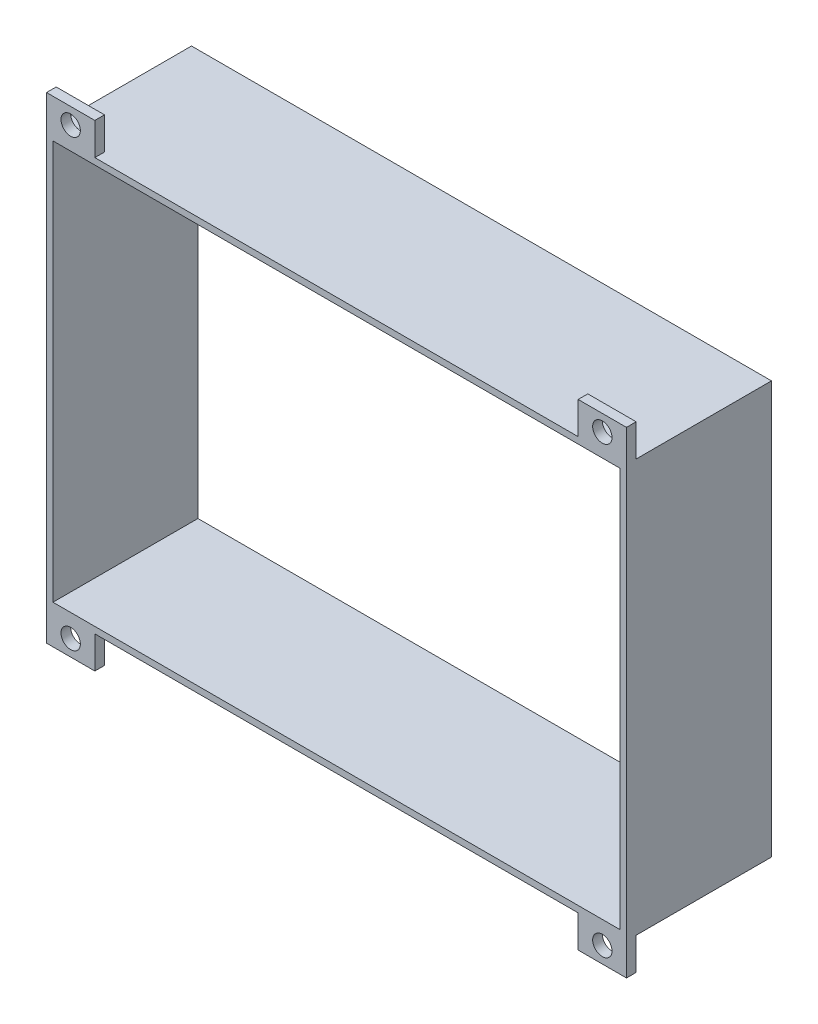
ISO-10303-21;
HEADER;
FILE_DESCRIPTION(('STEP AP214'),'2;1');
FILE_NAME('part.step','',(''),(''),'','','');
FILE_SCHEMA(('AUTOMOTIVE_DESIGN { 1 0 10303 214 1 1 1 1 }'));
ENDSEC;
DATA;
#1=APPLICATION_CONTEXT('core data for automotive mechanical design processes');
#2=APPLICATION_PROTOCOL_DEFINITION('international standard','automotive_design',2000,#1);
#3=PRODUCT_CONTEXT('',#1,'mechanical');
#4=PRODUCT('Part','Part','',(#3));
#5=PRODUCT_RELATED_PRODUCT_CATEGORY('part','',(#4));
#6=PRODUCT_DEFINITION_FORMATION('','',#4);
#7=PRODUCT_DEFINITION_CONTEXT('part definition',#1,'design');
#8=PRODUCT_DEFINITION('design','',#6,#7);
#9=PRODUCT_DEFINITION_SHAPE('','',#8);
#10=(LENGTH_UNIT() NAMED_UNIT(*) SI_UNIT(.MILLI.,.METRE.));
#11=(NAMED_UNIT(*) PLANE_ANGLE_UNIT() SI_UNIT($,.RADIAN.));
#12=(NAMED_UNIT(*) SI_UNIT($,.STERADIAN.) SOLID_ANGLE_UNIT());
#13=UNCERTAINTY_MEASURE_WITH_UNIT(LENGTH_MEASURE(1.E-05),#10,'distance_accuracy_value','');
#14=(GEOMETRIC_REPRESENTATION_CONTEXT(3) GLOBAL_UNCERTAINTY_ASSIGNED_CONTEXT((#13)) GLOBAL_UNIT_ASSIGNED_CONTEXT((#10,
#11,#12)) REPRESENTATION_CONTEXT('',''));
#15=CARTESIAN_POINT('',(0.,0.,0.));
#16=DIRECTION('',(0.,0.,1.));
#17=DIRECTION('',(1.,0.,0.));
#18=AXIS2_PLACEMENT_3D('',#15,#16,#17);
#19=CARTESIAN_POINT('',(-90.,-64.,45.));
#20=DIRECTION('',(0.,1.,0.));
#21=DIRECTION('',(0.,0.,1.));
#22=AXIS2_PLACEMENT_3D('',#19,#20,#21);
#23=PLANE('',#22);
#24=DIRECTION('',(1.,0.,0.));
#25=VECTOR('',#24,1.);
#26=CARTESIAN_POINT('',(-90.,-64.,42.));
#27=LINE('',#26,#25);
#28=CARTESIAN_POINT('',(-90.,-64.,42.));
#29=VERTEX_POINT('',#28);
#30=CARTESIAN_POINT('',(-75.,-64.,42.));
#31=VERTEX_POINT('',#30);
#32=EDGE_CURVE('E248',#29,#31,#27,.T.);
#33=ORIENTED_EDGE('',*,*,#32,.F.);
#34=DIRECTION('',(0.,0.,-1.));
#35=VECTOR('',#34,1.);
#36=CARTESIAN_POINT('',(-90.,-64.,45.));
#37=LINE('',#36,#35);
#38=CARTESIAN_POINT('',(-90.,-64.,0.));
#39=VERTEX_POINT('',#38);
#40=EDGE_CURVE('E342',#29,#39,#37,.T.);
#41=ORIENTED_EDGE('',*,*,#40,.T.);
#42=DIRECTION('',(1.,0.,0.));
#43=VECTOR('',#42,1.);
#44=CARTESIAN_POINT('',(-90.,-64.,0.));
#45=LINE('',#44,#43);
#46=CARTESIAN_POINT('',(90.,-64.,0.));
#47=VERTEX_POINT('',#46);
#48=EDGE_CURVE('E328',#39,#47,#45,.T.);
#49=ORIENTED_EDGE('',*,*,#48,.T.);
#50=DIRECTION('',(0.,0.,-1.));
#51=VECTOR('',#50,1.);
#52=CARTESIAN_POINT('',(90.,-64.,45.));
#53=LINE('',#52,#51);
#54=CARTESIAN_POINT('',(90.,-64.,42.));
#55=VERTEX_POINT('',#54);
#56=EDGE_CURVE('E331',#55,#47,#53,.T.);
#57=ORIENTED_EDGE('',*,*,#56,.F.);
#58=DIRECTION('',(1.,0.,0.));
#59=VECTOR('',#58,1.);
#60=CARTESIAN_POINT('',(90.,-64.,42.));
#61=LINE('',#60,#59);
#62=CARTESIAN_POINT('',(75.,-64.,42.));
#63=VERTEX_POINT('',#62);
#64=EDGE_CURVE('E275',#63,#55,#61,.T.);
#65=ORIENTED_EDGE('',*,*,#64,.F.);
#66=DIRECTION('',(0.,0.,-1.));
#67=VECTOR('',#66,1.);
#68=CARTESIAN_POINT('',(75.,-64.,45.));
#69=LINE('',#68,#67);
#70=CARTESIAN_POINT('',(75.,-64.,45.));
#71=VERTEX_POINT('',#70);
#72=EDGE_CURVE('E270',#71,#63,#69,.T.);
#73=ORIENTED_EDGE('',*,*,#72,.F.);
#74=DIRECTION('',(1.,0.,0.));
#75=VECTOR('',#74,1.);
#76=CARTESIAN_POINT('',(-90.,-64.,45.));
#77=LINE('',#76,#75);
#78=CARTESIAN_POINT('',(-75.,-64.,45.));
#79=VERTEX_POINT('',#78);
#80=EDGE_CURVE('E183',#79,#71,#77,.T.);
#81=ORIENTED_EDGE('',*,*,#80,.F.);
#82=DIRECTION('',(0.,0.,1.));
#83=VECTOR('',#82,1.);
#84=CARTESIAN_POINT('',(-75.,-64.,45.));
#85=LINE('',#84,#83);
#86=EDGE_CURVE('E251',#31,#79,#85,.T.);
#87=ORIENTED_EDGE('',*,*,#86,.F.);
#88=EDGE_LOOP('',(#33,#41,#49,#57,#65,#73,#81,#87));
#89=FACE_BOUND('',#88,.T.);
#90=ADVANCED_FACE('F33',(#89),#23,.F.);
#91=CARTESIAN_POINT('',(0.,0.,45.));
#92=DIRECTION('',(0.,0.,1.));
#93=DIRECTION('',(1.,0.,0.));
#94=AXIS2_PLACEMENT_3D('',#91,#92,#93);
#95=PLANE('',#94);
#96=CARTESIAN_POINT('',(82.5,69.,45.));
#97=DIRECTION('',(0.,0.,1.));
#98=DIRECTION('',(1.,0.,0.));
#99=AXIS2_PLACEMENT_3D('',#96,#97,#98);
#100=CIRCLE('',#99,3.00000000000001);
#101=CARTESIAN_POINT('',(85.5,69.,45.));
#102=VERTEX_POINT('',#101);
#103=EDGE_CURVE('E209',#102,#102,#100,.F.);
#104=ORIENTED_EDGE('',*,*,#103,.T.);
#105=EDGE_LOOP('',(#104));
#106=FACE_BOUND('',#105,.T.);
#107=CARTESIAN_POINT('',(-82.5,69.,45.));
#108=DIRECTION('',(0.,0.,1.));
#109=DIRECTION('',(1.,0.,0.));
#110=AXIS2_PLACEMENT_3D('',#107,#108,#109);
#111=CIRCLE('',#110,3.00000000000001);
#112=CARTESIAN_POINT('',(-79.5,69.,45.));
#113=VERTEX_POINT('',#112);
#114=EDGE_CURVE('E483',#113,#113,#111,.F.);
#115=ORIENTED_EDGE('',*,*,#114,.T.);
#116=EDGE_LOOP('',(#115));
#117=FACE_BOUND('',#116,.T.);
#118=CARTESIAN_POINT('',(82.5,-69.,45.));
#119=DIRECTION('',(0.,0.,1.));
#120=DIRECTION('',(1.,0.,0.));
#121=AXIS2_PLACEMENT_3D('',#118,#119,#120);
#122=CIRCLE('',#121,3.00000000000001);
#123=CARTESIAN_POINT('',(85.5,-69.,45.));
#124=VERTEX_POINT('',#123);
#125=EDGE_CURVE('E245',#124,#124,#122,.T.);
#126=ORIENTED_EDGE('',*,*,#125,.F.);
#127=EDGE_LOOP('',(#126));
#128=FACE_BOUND('',#127,.T.);
#129=CARTESIAN_POINT('',(-82.5,-69.,45.));
#130=DIRECTION('',(0.,0.,1.));
#131=DIRECTION('',(1.,0.,0.));
#132=AXIS2_PLACEMENT_3D('',#129,#130,#131);
#133=CIRCLE('',#132,3.00000000000001);
#134=CARTESIAN_POINT('',(-79.5,-69.,45.));
#135=VERTEX_POINT('',#134);
#136=EDGE_CURVE('E240',#135,#135,#133,.T.);
#137=ORIENTED_EDGE('',*,*,#136,.F.);
#138=EDGE_LOOP('',(#137));
#139=FACE_BOUND('',#138,.T.);
#140=DIRECTION('',(0.,1.,0.));
#141=VECTOR('',#140,1.);
#142=CARTESIAN_POINT('',(90.,64.,45.));
#143=LINE('',#142,#141);
#144=CARTESIAN_POINT('',(90.,-74.,45.));
#145=VERTEX_POINT('',#144);
#146=CARTESIAN_POINT('',(90.,74.,45.));
#147=VERTEX_POINT('',#146);
#148=EDGE_CURVE('E326',#145,#147,#143,.T.);
#149=ORIENTED_EDGE('',*,*,#148,.T.);
#150=DIRECTION('',(-1.,0.,0.));
#151=VECTOR('',#150,1.);
#152=CARTESIAN_POINT('',(90.,74.,45.));
#153=LINE('',#152,#151);
#154=CARTESIAN_POINT('',(75.,74.,45.));
#155=VERTEX_POINT('',#154);
#156=EDGE_CURVE('E225',#147,#155,#153,.T.);
#157=ORIENTED_EDGE('',*,*,#156,.T.);
#158=DIRECTION('',(0.,-1.,0.));
#159=VECTOR('',#158,1.);
#160=CARTESIAN_POINT('',(75.,74.,45.));
#161=LINE('',#160,#159);
#162=CARTESIAN_POINT('',(75.,64.,45.));
#163=VERTEX_POINT('',#162);
#164=EDGE_CURVE('E228',#155,#163,#161,.T.);
#165=ORIENTED_EDGE('',*,*,#164,.T.);
#166=DIRECTION('',(-1.,0.,0.));
#167=VECTOR('',#166,1.);
#168=CARTESIAN_POINT('',(-90.,64.,45.));
#169=LINE('',#168,#167);
#170=CARTESIAN_POINT('',(-75.,64.,45.));
#171=VERTEX_POINT('',#170);
#172=EDGE_CURVE('E184',#163,#171,#169,.T.);
#173=ORIENTED_EDGE('',*,*,#172,.T.);
#174=DIRECTION('',(0.,-1.,0.));
#175=VECTOR('',#174,1.);
#176=CARTESIAN_POINT('',(-75.,74.,45.));
#177=LINE('',#176,#175);
#178=CARTESIAN_POINT('',(-75.,74.,45.));
#179=VERTEX_POINT('',#178);
#180=EDGE_CURVE('E198',#179,#171,#177,.T.);
#181=ORIENTED_EDGE('',*,*,#180,.F.);
#182=DIRECTION('',(-1.,0.,0.));
#183=VECTOR('',#182,1.);
#184=CARTESIAN_POINT('',(-90.,74.,45.));
#185=LINE('',#184,#183);
#186=CARTESIAN_POINT('',(-90.,74.,45.));
#187=VERTEX_POINT('',#186);
#188=EDGE_CURVE('E190',#179,#187,#185,.T.);
#189=ORIENTED_EDGE('',*,*,#188,.T.);
#190=DIRECTION('',(0.,-1.,0.));
#191=VECTOR('',#190,1.);
#192=CARTESIAN_POINT('',(-90.,64.,45.));
#193=LINE('',#192,#191);
#194=CARTESIAN_POINT('',(-90.,-74.,45.));
#195=VERTEX_POINT('',#194);
#196=EDGE_CURVE('E170',#187,#195,#193,.T.);
#197=ORIENTED_EDGE('',*,*,#196,.T.);
#198=DIRECTION('',(-1.,0.,0.));
#199=VECTOR('',#198,1.);
#200=CARTESIAN_POINT('',(-90.,-74.,45.));
#201=LINE('',#200,#199);
#202=CARTESIAN_POINT('',(-75.,-74.,45.));
#203=VERTEX_POINT('',#202);
#204=EDGE_CURVE('E255',#203,#195,#201,.T.);
#205=ORIENTED_EDGE('',*,*,#204,.F.);
#206=DIRECTION('',(0.,1.,0.));
#207=VECTOR('',#206,1.);
#208=CARTESIAN_POINT('',(-75.,-74.,45.));
#209=LINE('',#208,#207);
#210=EDGE_CURVE('E257',#203,#79,#209,.T.);
#211=ORIENTED_EDGE('',*,*,#210,.T.);
#212=ORIENTED_EDGE('',*,*,#80,.T.);
#213=DIRECTION('',(0.,1.,0.));
#214=VECTOR('',#213,1.);
#215=CARTESIAN_POINT('',(75.,-74.,45.));
#216=LINE('',#215,#214);
#217=CARTESIAN_POINT('',(75.,-74.,45.));
#218=VERTEX_POINT('',#217);
#219=EDGE_CURVE('E291',#218,#71,#216,.T.);
#220=ORIENTED_EDGE('',*,*,#219,.F.);
#221=DIRECTION('',(-1.,0.,0.));
#222=VECTOR('',#221,1.);
#223=CARTESIAN_POINT('',(90.,-74.,45.));
#224=LINE('',#223,#222);
#225=EDGE_CURVE('E274',#145,#218,#224,.T.);
#226=ORIENTED_EDGE('',*,*,#225,.F.);
#227=EDGE_LOOP('',(#149,#157,#165,#173,#181,#189,#197,#205,#211,#212,#220,#226));
#228=FACE_BOUND('',#227,.T.);
#229=DIRECTION('',(-1.,0.,0.));
#230=VECTOR('',#229,1.);
#231=CARTESIAN_POINT('',(-88.,62.,45.));
#232=LINE('',#231,#230);
#233=CARTESIAN_POINT('',(88.,62.,45.));
#234=VERTEX_POINT('',#233);
#235=CARTESIAN_POINT('',(-88.,62.,45.));
#236=VERTEX_POINT('',#235);
#237=EDGE_CURVE('E297',#234,#236,#232,.T.);
#238=ORIENTED_EDGE('',*,*,#237,.F.);
#239=DIRECTION('',(0.,1.,0.));
#240=VECTOR('',#239,1.);
#241=CARTESIAN_POINT('',(88.,62.,45.));
#242=LINE('',#241,#240);
#243=CARTESIAN_POINT('',(88.,-62.,45.));
#244=VERTEX_POINT('',#243);
#245=EDGE_CURVE('E295',#244,#234,#242,.T.);
#246=ORIENTED_EDGE('',*,*,#245,.F.);
#247=DIRECTION('',(1.,0.,0.));
#248=VECTOR('',#247,1.);
#249=CARTESIAN_POINT('',(-88.,-62.,45.));
#250=LINE('',#249,#248);
#251=CARTESIAN_POINT('',(-88.,-62.,45.));
#252=VERTEX_POINT('',#251);
#253=EDGE_CURVE('E303',#252,#244,#250,.T.);
#254=ORIENTED_EDGE('',*,*,#253,.F.);
#255=DIRECTION('',(0.,-1.,0.));
#256=VECTOR('',#255,1.);
#257=CARTESIAN_POINT('',(-88.,62.,45.));
#258=LINE('',#257,#256);
#259=EDGE_CURVE('E300',#236,#252,#258,.T.);
#260=ORIENTED_EDGE('',*,*,#259,.F.);
#261=EDGE_LOOP('',(#238,#246,#254,#260));
#262=FACE_BOUND('',#261,.T.);
#263=ADVANCED_FACE('F195',(#106,#117,#128,#139,#228,#262),#95,.T.);
#264=CARTESIAN_POINT('',(0.,0.,0.));
#265=DIRECTION('',(0.,0.,1.));
#266=DIRECTION('',(1.,0.,0.));
#267=AXIS2_PLACEMENT_3D('',#264,#265,#266);
#268=PLANE('',#267);
#269=DIRECTION('',(0.,1.,0.));
#270=VECTOR('',#269,1.);
#271=CARTESIAN_POINT('',(90.,64.,0.));
#272=LINE('',#271,#270);
#273=CARTESIAN_POINT('',(90.,64.,0.));
#274=VERTEX_POINT('',#273);
#275=EDGE_CURVE('E325',#47,#274,#272,.T.);
#276=ORIENTED_EDGE('',*,*,#275,.F.);
#277=ORIENTED_EDGE('',*,*,#48,.F.);
#278=DIRECTION('',(0.,-1.,0.));
#279=VECTOR('',#278,1.);
#280=CARTESIAN_POINT('',(-90.,64.,0.));
#281=LINE('',#280,#279);
#282=CARTESIAN_POINT('',(-90.,64.,0.));
#283=VERTEX_POINT('',#282);
#284=EDGE_CURVE('E337',#283,#39,#281,.T.);
#285=ORIENTED_EDGE('',*,*,#284,.F.);
#286=DIRECTION('',(-1.,0.,0.));
#287=VECTOR('',#286,1.);
#288=CARTESIAN_POINT('',(-90.,64.,0.));
#289=LINE('',#288,#287);
#290=EDGE_CURVE('E334',#274,#283,#289,.T.);
#291=ORIENTED_EDGE('',*,*,#290,.F.);
#292=EDGE_LOOP('',(#276,#277,#285,#291));
#293=FACE_BOUND('',#292,.T.);
#294=DIRECTION('',(0.,1.,0.));
#295=VECTOR('',#294,1.);
#296=CARTESIAN_POINT('',(88.,62.,0.));
#297=LINE('',#296,#295);
#298=CARTESIAN_POINT('',(88.,-62.,0.));
#299=VERTEX_POINT('',#298);
#300=CARTESIAN_POINT('',(88.,62.,0.));
#301=VERTEX_POINT('',#300);
#302=EDGE_CURVE('E294',#299,#301,#297,.T.);
#303=ORIENTED_EDGE('',*,*,#302,.T.);
#304=DIRECTION('',(-1.,0.,0.));
#305=VECTOR('',#304,1.);
#306=CARTESIAN_POINT('',(-88.,62.,0.));
#307=LINE('',#306,#305);
#308=CARTESIAN_POINT('',(-88.,62.,0.));
#309=VERTEX_POINT('',#308);
#310=EDGE_CURVE('E308',#301,#309,#307,.T.);
#311=ORIENTED_EDGE('',*,*,#310,.T.);
#312=DIRECTION('',(0.,-1.,0.));
#313=VECTOR('',#312,1.);
#314=CARTESIAN_POINT('',(-88.,62.,0.));
#315=LINE('',#314,#313);
#316=CARTESIAN_POINT('',(-88.,-62.,0.));
#317=VERTEX_POINT('',#316);
#318=EDGE_CURVE('E311',#309,#317,#315,.T.);
#319=ORIENTED_EDGE('',*,*,#318,.T.);
#320=DIRECTION('',(1.,0.,0.));
#321=VECTOR('',#320,1.);
#322=CARTESIAN_POINT('',(-88.,-62.,0.));
#323=LINE('',#322,#321);
#324=EDGE_CURVE('E298',#317,#299,#323,.T.);
#325=ORIENTED_EDGE('',*,*,#324,.T.);
#326=EDGE_LOOP('',(#303,#311,#319,#325));
#327=FACE_BOUND('',#326,.T.);
#328=ADVANCED_FACE('F352',(#293,#327),#268,.F.);
#329=CARTESIAN_POINT('',(90.,64.,45.));
#330=DIRECTION('',(-1.,0.,0.));
#331=DIRECTION('',(0.,-1.,0.));
#332=AXIS2_PLACEMENT_3D('',#329,#330,#331);
#333=PLANE('',#332);
#334=ORIENTED_EDGE('',*,*,#275,.T.);
#335=DIRECTION('',(0.,0.,-1.));
#336=VECTOR('',#335,1.);
#337=CARTESIAN_POINT('',(90.,64.,45.));
#338=LINE('',#337,#336);
#339=CARTESIAN_POINT('',(90.,64.,42.));
#340=VERTEX_POINT('',#339);
#341=EDGE_CURVE('E11',#340,#274,#338,.T.);
#342=ORIENTED_EDGE('',*,*,#341,.F.);
#343=DIRECTION('',(0.,-1.,0.));
#344=VECTOR('',#343,1.);
#345=CARTESIAN_POINT('',(90.,74.,42.));
#346=LINE('',#345,#344);
#347=CARTESIAN_POINT('',(90.,74.,42.));
#348=VERTEX_POINT('',#347);
#349=EDGE_CURVE('E56',#348,#340,#346,.T.);
#350=ORIENTED_EDGE('',*,*,#349,.F.);
#351=DIRECTION('',(0.,0.,1.));
#352=VECTOR('',#351,1.);
#353=CARTESIAN_POINT('',(90.,74.,45.));
#354=LINE('',#353,#352);
#355=EDGE_CURVE('E216',#348,#147,#354,.T.);
#356=ORIENTED_EDGE('',*,*,#355,.T.);
#357=ORIENTED_EDGE('',*,*,#148,.F.);
#358=DIRECTION('',(0.,0.,1.));
#359=VECTOR('',#358,1.);
#360=CARTESIAN_POINT('',(90.,-74.,45.));
#361=LINE('',#360,#359);
#362=CARTESIAN_POINT('',(90.,-74.,42.));
#363=VERTEX_POINT('',#362);
#364=EDGE_CURVE('E271',#363,#145,#361,.T.);
#365=ORIENTED_EDGE('',*,*,#364,.F.);
#366=DIRECTION('',(0.,1.,0.));
#367=VECTOR('',#366,1.);
#368=CARTESIAN_POINT('',(90.,-74.,42.));
#369=LINE('',#368,#367);
#370=EDGE_CURVE('E281',#363,#55,#369,.T.);
#371=ORIENTED_EDGE('',*,*,#370,.T.);
#372=ORIENTED_EDGE('',*,*,#56,.T.);
#373=EDGE_LOOP('',(#334,#342,#350,#356,#357,#365,#371,#372));
#374=FACE_BOUND('',#373,.T.);
#375=ADVANCED_FACE('F35',(#374),#333,.F.);
#376=CARTESIAN_POINT('',(-90.,64.,45.));
#377=DIRECTION('',(0.,-1.,0.));
#378=DIRECTION('',(0.,0.,-1.));
#379=AXIS2_PLACEMENT_3D('',#376,#377,#378);
#380=PLANE('',#379);
#381=DIRECTION('',(1.,0.,0.));
#382=VECTOR('',#381,1.);
#383=CARTESIAN_POINT('',(-90.,64.,42.));
#384=LINE('',#383,#382);
#385=CARTESIAN_POINT('',(-90.,64.,42.));
#386=VERTEX_POINT('',#385);
#387=CARTESIAN_POINT('',(-75.,64.,42.));
#388=VERTEX_POINT('',#387);
#389=EDGE_CURVE('E48',#386,#388,#384,.T.);
#390=ORIENTED_EDGE('',*,*,#389,.T.);
#391=DIRECTION('',(0.,0.,1.));
#392=VECTOR('',#391,1.);
#393=CARTESIAN_POINT('',(-75.,64.,45.));
#394=LINE('',#393,#392);
#395=EDGE_CURVE('E206',#388,#171,#394,.T.);
#396=ORIENTED_EDGE('',*,*,#395,.T.);
#397=ORIENTED_EDGE('',*,*,#172,.F.);
#398=DIRECTION('',(0.,0.,-1.));
#399=VECTOR('',#398,1.);
#400=CARTESIAN_POINT('',(75.,64.,45.));
#401=LINE('',#400,#399);
#402=CARTESIAN_POINT('',(75.,64.,42.));
#403=VERTEX_POINT('',#402);
#404=EDGE_CURVE('E220',#163,#403,#401,.T.);
#405=ORIENTED_EDGE('',*,*,#404,.T.);
#406=DIRECTION('',(1.,0.,0.));
#407=VECTOR('',#406,1.);
#408=CARTESIAN_POINT('',(90.,64.,42.));
#409=LINE('',#408,#407);
#410=EDGE_CURVE('E215',#403,#340,#409,.T.);
#411=ORIENTED_EDGE('',*,*,#410,.T.);
#412=ORIENTED_EDGE('',*,*,#341,.T.);
#413=ORIENTED_EDGE('',*,*,#290,.T.);
#414=DIRECTION('',(0.,0.,-1.));
#415=VECTOR('',#414,1.);
#416=CARTESIAN_POINT('',(-90.,64.,45.));
#417=LINE('',#416,#415);
#418=EDGE_CURVE('E41',#386,#283,#417,.T.);
#419=ORIENTED_EDGE('',*,*,#418,.F.);
#420=EDGE_LOOP('',(#390,#396,#397,#405,#411,#412,#413,#419));
#421=FACE_BOUND('',#420,.T.);
#422=ADVANCED_FACE('F348',(#421),#380,.F.);
#423=CARTESIAN_POINT('',(-90.,64.,45.));
#424=DIRECTION('',(1.,0.,0.));
#425=DIRECTION('',(0.,0.,-1.));
#426=AXIS2_PLACEMENT_3D('',#423,#424,#425);
#427=PLANE('',#426);
#428=ORIENTED_EDGE('',*,*,#284,.T.);
#429=ORIENTED_EDGE('',*,*,#40,.F.);
#430=DIRECTION('',(0.,1.,0.));
#431=VECTOR('',#430,1.);
#432=CARTESIAN_POINT('',(-90.,-74.,42.));
#433=LINE('',#432,#431);
#434=CARTESIAN_POINT('',(-90.,-74.,42.));
#435=VERTEX_POINT('',#434);
#436=EDGE_CURVE('E267',#435,#29,#433,.T.);
#437=ORIENTED_EDGE('',*,*,#436,.F.);
#438=DIRECTION('',(0.,0.,-1.));
#439=VECTOR('',#438,1.);
#440=CARTESIAN_POINT('',(-90.,-74.,45.));
#441=LINE('',#440,#439);
#442=EDGE_CURVE('E178',#195,#435,#441,.T.);
#443=ORIENTED_EDGE('',*,*,#442,.F.);
#444=ORIENTED_EDGE('',*,*,#196,.F.);
#445=DIRECTION('',(0.,0.,-1.));
#446=VECTOR('',#445,1.);
#447=CARTESIAN_POINT('',(-90.,74.,45.));
#448=LINE('',#447,#446);
#449=CARTESIAN_POINT('',(-90.,74.,42.));
#450=VERTEX_POINT('',#449);
#451=EDGE_CURVE('E174',#187,#450,#448,.T.);
#452=ORIENTED_EDGE('',*,*,#451,.T.);
#453=DIRECTION('',(0.,-1.,0.));
#454=VECTOR('',#453,1.);
#455=CARTESIAN_POINT('',(-90.,74.,42.));
#456=LINE('',#455,#454);
#457=EDGE_CURVE('E205',#450,#386,#456,.T.);
#458=ORIENTED_EDGE('',*,*,#457,.T.);
#459=ORIENTED_EDGE('',*,*,#418,.T.);
#460=EDGE_LOOP('',(#428,#429,#437,#443,#444,#452,#458,#459));
#461=FACE_BOUND('',#460,.T.);
#462=ADVANCED_FACE('F173',(#461),#427,.F.);
#463=CARTESIAN_POINT('',(88.,62.,45.));
#464=DIRECTION('',(-1.,0.,0.));
#465=DIRECTION('',(0.,-1.,0.));
#466=AXIS2_PLACEMENT_3D('',#463,#464,#465);
#467=PLANE('',#466);
#468=ORIENTED_EDGE('',*,*,#302,.F.);
#469=DIRECTION('',(0.,0.,-1.));
#470=VECTOR('',#469,1.);
#471=CARTESIAN_POINT('',(88.,-62.,45.));
#472=LINE('',#471,#470);
#473=EDGE_CURVE('E305',#244,#299,#472,.T.);
#474=ORIENTED_EDGE('',*,*,#473,.F.);
#475=ORIENTED_EDGE('',*,*,#245,.T.);
#476=DIRECTION('',(0.,0.,-1.));
#477=VECTOR('',#476,1.);
#478=CARTESIAN_POINT('',(88.,62.,45.));
#479=LINE('',#478,#477);
#480=EDGE_CURVE('E322',#234,#301,#479,.T.);
#481=ORIENTED_EDGE('',*,*,#480,.T.);
#482=EDGE_LOOP('',(#468,#474,#475,#481));
#483=FACE_BOUND('',#482,.T.);
#484=ADVANCED_FACE('F413',(#483),#467,.T.);
#485=CARTESIAN_POINT('',(-88.,62.,45.));
#486=DIRECTION('',(0.,-1.,0.));
#487=DIRECTION('',(1.,0.,0.));
#488=AXIS2_PLACEMENT_3D('',#485,#486,#487);
#489=PLANE('',#488);
#490=ORIENTED_EDGE('',*,*,#310,.F.);
#491=ORIENTED_EDGE('',*,*,#480,.F.);
#492=ORIENTED_EDGE('',*,*,#237,.T.);
#493=DIRECTION('',(0.,0.,-1.));
#494=VECTOR('',#493,1.);
#495=CARTESIAN_POINT('',(-88.,62.,45.));
#496=LINE('',#495,#494);
#497=EDGE_CURVE('E320',#236,#309,#496,.T.);
#498=ORIENTED_EDGE('',*,*,#497,.T.);
#499=EDGE_LOOP('',(#490,#491,#492,#498));
#500=FACE_BOUND('',#499,.T.);
#501=ADVANCED_FACE('F525',(#500),#489,.T.);
#502=CARTESIAN_POINT('',(-88.,62.,45.));
#503=DIRECTION('',(1.,0.,0.));
#504=DIRECTION('',(0.,1.,0.));
#505=AXIS2_PLACEMENT_3D('',#502,#503,#504);
#506=PLANE('',#505);
#507=ORIENTED_EDGE('',*,*,#318,.F.);
#508=ORIENTED_EDGE('',*,*,#497,.F.);
#509=ORIENTED_EDGE('',*,*,#259,.T.);
#510=DIRECTION('',(0.,0.,-1.));
#511=VECTOR('',#510,1.);
#512=CARTESIAN_POINT('',(-88.,-62.,45.));
#513=LINE('',#512,#511);
#514=EDGE_CURVE('E318',#252,#317,#513,.T.);
#515=ORIENTED_EDGE('',*,*,#514,.T.);
#516=EDGE_LOOP('',(#507,#508,#509,#515));
#517=FACE_BOUND('',#516,.T.);
#518=ADVANCED_FACE('F521',(#517),#506,.T.);
#519=CARTESIAN_POINT('',(-88.,-62.,45.));
#520=DIRECTION('',(0.,1.,0.));
#521=DIRECTION('',(0.,0.,1.));
#522=AXIS2_PLACEMENT_3D('',#519,#520,#521);
#523=PLANE('',#522);
#524=ORIENTED_EDGE('',*,*,#324,.F.);
#525=ORIENTED_EDGE('',*,*,#514,.F.);
#526=ORIENTED_EDGE('',*,*,#253,.T.);
#527=ORIENTED_EDGE('',*,*,#473,.T.);
#528=EDGE_LOOP('',(#524,#525,#526,#527));
#529=FACE_BOUND('',#528,.T.);
#530=ADVANCED_FACE('F518',(#529),#523,.T.);
#531=CARTESIAN_POINT('',(75.,-74.,45.));
#532=DIRECTION('',(1.,0.,0.));
#533=DIRECTION('',(0.,0.,-1.));
#534=AXIS2_PLACEMENT_3D('',#531,#532,#533);
#535=PLANE('',#534);
#536=ORIENTED_EDGE('',*,*,#72,.T.);
#537=DIRECTION('',(0.,1.,0.));
#538=VECTOR('',#537,1.);
#539=CARTESIAN_POINT('',(75.,-74.,42.));
#540=LINE('',#539,#538);
#541=CARTESIAN_POINT('',(75.,-74.,42.));
#542=VERTEX_POINT('',#541);
#543=EDGE_CURVE('E288',#542,#63,#540,.T.);
#544=ORIENTED_EDGE('',*,*,#543,.F.);
#545=DIRECTION('',(0.,0.,-1.));
#546=VECTOR('',#545,1.);
#547=CARTESIAN_POINT('',(75.,-74.,45.));
#548=LINE('',#547,#546);
#549=EDGE_CURVE('E277',#218,#542,#548,.T.);
#550=ORIENTED_EDGE('',*,*,#549,.F.);
#551=ORIENTED_EDGE('',*,*,#219,.T.);
#552=EDGE_LOOP('',(#536,#544,#550,#551));
#553=FACE_BOUND('',#552,.T.);
#554=ADVANCED_FACE('F370',(#553),#535,.F.);
#555=CARTESIAN_POINT('',(90.,-74.,42.));
#556=DIRECTION('',(0.,0.,1.));
#557=DIRECTION('',(1.,0.,0.));
#558=AXIS2_PLACEMENT_3D('',#555,#556,#557);
#559=PLANE('',#558);
#560=CARTESIAN_POINT('',(82.5,-69.,42.));
#561=DIRECTION('',(0.,0.,-1.));
#562=DIRECTION('',(-1.,0.,0.));
#563=AXIS2_PLACEMENT_3D('',#560,#561,#562);
#564=CIRCLE('',#563,3.00000000000001);
#565=CARTESIAN_POINT('',(79.5,-69.,42.));
#566=VERTEX_POINT('',#565);
#567=EDGE_CURVE('E237',#566,#566,#564,.T.);
#568=ORIENTED_EDGE('',*,*,#567,.F.);
#569=EDGE_LOOP('',(#568));
#570=FACE_BOUND('',#569,.T.);
#571=ORIENTED_EDGE('',*,*,#64,.T.);
#572=ORIENTED_EDGE('',*,*,#370,.F.);
#573=DIRECTION('',(1.,0.,0.));
#574=VECTOR('',#573,1.);
#575=CARTESIAN_POINT('',(90.,-74.,42.));
#576=LINE('',#575,#574);
#577=EDGE_CURVE('E279',#542,#363,#576,.T.);
#578=ORIENTED_EDGE('',*,*,#577,.F.);
#579=ORIENTED_EDGE('',*,*,#543,.T.);
#580=EDGE_LOOP('',(#571,#572,#578,#579));
#581=FACE_BOUND('',#580,.T.);
#582=ADVANCED_FACE('F509',(#570,#581),#559,.F.);
#583=CARTESIAN_POINT('',(0.,-74.,0.));
#584=DIRECTION('',(0.,1.,0.));
#585=DIRECTION('',(0.,0.,1.));
#586=AXIS2_PLACEMENT_3D('',#583,#584,#585);
#587=PLANE('',#586);
#588=ORIENTED_EDGE('',*,*,#364,.T.);
#589=ORIENTED_EDGE('',*,*,#225,.T.);
#590=ORIENTED_EDGE('',*,*,#549,.T.);
#591=ORIENTED_EDGE('',*,*,#577,.T.);
#592=EDGE_LOOP('',(#588,#589,#590,#591));
#593=FACE_BOUND('',#592,.T.);
#594=ADVANCED_FACE('F374',(#593),#587,.F.);
#595=CARTESIAN_POINT('',(-90.,-74.,42.));
#596=DIRECTION('',(0.,0.,1.));
#597=DIRECTION('',(1.,0.,0.));
#598=AXIS2_PLACEMENT_3D('',#595,#596,#597);
#599=PLANE('',#598);
#600=CARTESIAN_POINT('',(-82.5,-69.,42.));
#601=DIRECTION('',(0.,0.,-1.));
#602=DIRECTION('',(-1.,0.,0.));
#603=AXIS2_PLACEMENT_3D('',#600,#601,#602);
#604=CIRCLE('',#603,3.00000000000001);
#605=CARTESIAN_POINT('',(-85.5,-69.,42.));
#606=VERTEX_POINT('',#605);
#607=EDGE_CURVE('E236',#606,#606,#604,.T.);
#608=ORIENTED_EDGE('',*,*,#607,.F.);
#609=EDGE_LOOP('',(#608));
#610=FACE_BOUND('',#609,.T.);
#611=ORIENTED_EDGE('',*,*,#32,.T.);
#612=DIRECTION('',(0.,1.,0.));
#613=VECTOR('',#612,1.);
#614=CARTESIAN_POINT('',(-75.,-74.,42.));
#615=LINE('',#614,#613);
#616=CARTESIAN_POINT('',(-75.,-74.,42.));
#617=VERTEX_POINT('',#616);
#618=EDGE_CURVE('E264',#617,#31,#615,.T.);
#619=ORIENTED_EDGE('',*,*,#618,.F.);
#620=DIRECTION('',(1.,0.,0.));
#621=VECTOR('',#620,1.);
#622=CARTESIAN_POINT('',(-90.,-74.,42.));
#623=LINE('',#622,#621);
#624=EDGE_CURVE('E250',#435,#617,#623,.T.);
#625=ORIENTED_EDGE('',*,*,#624,.F.);
#626=ORIENTED_EDGE('',*,*,#436,.T.);
#627=EDGE_LOOP('',(#611,#619,#625,#626));
#628=FACE_BOUND('',#627,.T.);
#629=ADVANCED_FACE('F357',(#610,#628),#599,.F.);
#630=CARTESIAN_POINT('',(-75.,-74.,45.));
#631=DIRECTION('',(-1.,0.,0.));
#632=DIRECTION('',(0.,0.,1.));
#633=AXIS2_PLACEMENT_3D('',#630,#631,#632);
#634=PLANE('',#633);
#635=ORIENTED_EDGE('',*,*,#86,.T.);
#636=ORIENTED_EDGE('',*,*,#210,.F.);
#637=DIRECTION('',(0.,0.,1.));
#638=VECTOR('',#637,1.);
#639=CARTESIAN_POINT('',(-75.,-74.,45.));
#640=LINE('',#639,#638);
#641=EDGE_CURVE('E253',#617,#203,#640,.T.);
#642=ORIENTED_EDGE('',*,*,#641,.F.);
#643=ORIENTED_EDGE('',*,*,#618,.T.);
#644=EDGE_LOOP('',(#635,#636,#642,#643));
#645=FACE_BOUND('',#644,.T.);
#646=ADVANCED_FACE('F366',(#645),#634,.F.);
#647=CARTESIAN_POINT('',(0.,-74.,0.));
#648=DIRECTION('',(0.,-1.,0.));
#649=DIRECTION('',(0.,0.,-1.));
#650=AXIS2_PLACEMENT_3D('',#647,#648,#649);
#651=PLANE('',#650);
#652=ORIENTED_EDGE('',*,*,#442,.T.);
#653=ORIENTED_EDGE('',*,*,#624,.T.);
#654=ORIENTED_EDGE('',*,*,#641,.T.);
#655=ORIENTED_EDGE('',*,*,#204,.T.);
#656=EDGE_LOOP('',(#652,#653,#654,#655));
#657=FACE_BOUND('',#656,.T.);
#658=ADVANCED_FACE('F361',(#657),#651,.T.);
#659=CARTESIAN_POINT('',(-82.5,-69.,52.));
#660=DIRECTION('',(0.,0.,-1.));
#661=DIRECTION('',(-1.,0.,0.));
#662=AXIS2_PLACEMENT_3D('',#659,#660,#661);
#663=CYLINDRICAL_SURFACE('',#662,3.00000000000001);
#664=ORIENTED_EDGE('',*,*,#136,.T.);
#665=EDGE_LOOP('',(#664));
#666=FACE_BOUND('',#665,.T.);
#667=ORIENTED_EDGE('',*,*,#607,.T.);
#668=EDGE_LOOP('',(#667));
#669=FACE_BOUND('',#668,.T.);
#670=ADVANCED_FACE('F496',(#666,#669),#663,.F.);
#671=CARTESIAN_POINT('',(82.5,-69.,52.));
#672=DIRECTION('',(0.,0.,-1.));
#673=DIRECTION('',(-1.,0.,0.));
#674=AXIS2_PLACEMENT_3D('',#671,#672,#673);
#675=CYLINDRICAL_SURFACE('',#674,3.00000000000001);
#676=ORIENTED_EDGE('',*,*,#125,.T.);
#677=EDGE_LOOP('',(#676));
#678=FACE_BOUND('',#677,.T.);
#679=ORIENTED_EDGE('',*,*,#567,.T.);
#680=EDGE_LOOP('',(#679));
#681=FACE_BOUND('',#680,.T.);
#682=ADVANCED_FACE('F443',(#678,#681),#675,.F.);
#683=CARTESIAN_POINT('',(90.,74.,42.));
#684=DIRECTION('',(0.,0.,-1.));
#685=DIRECTION('',(-1.,0.,0.));
#686=AXIS2_PLACEMENT_3D('',#683,#684,#685);
#687=PLANE('',#686);
#688=CARTESIAN_POINT('',(82.5,69.,42.));
#689=DIRECTION('',(0.,0.,1.));
#690=DIRECTION('',(-1.,0.,0.));
#691=AXIS2_PLACEMENT_3D('',#688,#689,#690);
#692=CIRCLE('',#691,3.00000000000001);
#693=CARTESIAN_POINT('',(79.5,69.,42.));
#694=VERTEX_POINT('',#693);
#695=EDGE_CURVE('E482',#694,#694,#692,.T.);
#696=ORIENTED_EDGE('',*,*,#695,.T.);
#697=EDGE_LOOP('',(#696));
#698=FACE_BOUND('',#697,.T.);
#699=ORIENTED_EDGE('',*,*,#410,.F.);
#700=DIRECTION('',(0.,-1.,0.));
#701=VECTOR('',#700,1.);
#702=CARTESIAN_POINT('',(75.,74.,42.));
#703=LINE('',#702,#701);
#704=CARTESIAN_POINT('',(75.,74.,42.));
#705=VERTEX_POINT('',#704);
#706=EDGE_CURVE('E233',#705,#403,#703,.T.);
#707=ORIENTED_EDGE('',*,*,#706,.F.);
#708=DIRECTION('',(1.,0.,0.));
#709=VECTOR('',#708,1.);
#710=CARTESIAN_POINT('',(90.,74.,42.));
#711=LINE('',#710,#709);
#712=EDGE_CURVE('E219',#705,#348,#711,.T.);
#713=ORIENTED_EDGE('',*,*,#712,.T.);
#714=ORIENTED_EDGE('',*,*,#349,.T.);
#715=EDGE_LOOP('',(#699,#707,#713,#714));
#716=FACE_BOUND('',#715,.T.);
#717=ADVANCED_FACE('F439',(#698,#716),#687,.T.);
#718=CARTESIAN_POINT('',(75.,74.,45.));
#719=DIRECTION('',(-1.,0.,0.));
#720=DIRECTION('',(0.,0.,1.));
#721=AXIS2_PLACEMENT_3D('',#718,#719,#720);
#722=PLANE('',#721);
#723=ORIENTED_EDGE('',*,*,#404,.F.);
#724=ORIENTED_EDGE('',*,*,#164,.F.);
#725=DIRECTION('',(0.,0.,-1.));
#726=VECTOR('',#725,1.);
#727=CARTESIAN_POINT('',(75.,74.,45.));
#728=LINE('',#727,#726);
#729=EDGE_CURVE('E222',#155,#705,#728,.T.);
#730=ORIENTED_EDGE('',*,*,#729,.T.);
#731=ORIENTED_EDGE('',*,*,#706,.T.);
#732=EDGE_LOOP('',(#723,#724,#730,#731));
#733=FACE_BOUND('',#732,.T.);
#734=ADVANCED_FACE('F387',(#733),#722,.T.);
#735=CARTESIAN_POINT('',(0.,74.,0.));
#736=DIRECTION('',(0.,-1.,0.));
#737=DIRECTION('',(0.,0.,1.));
#738=AXIS2_PLACEMENT_3D('',#735,#736,#737);
#739=PLANE('',#738);
#740=ORIENTED_EDGE('',*,*,#355,.F.);
#741=ORIENTED_EDGE('',*,*,#712,.F.);
#742=ORIENTED_EDGE('',*,*,#729,.F.);
#743=ORIENTED_EDGE('',*,*,#156,.F.);
#744=EDGE_LOOP('',(#740,#741,#742,#743));
#745=FACE_BOUND('',#744,.T.);
#746=ADVANCED_FACE('F383',(#745),#739,.F.);
#747=CARTESIAN_POINT('',(-75.,74.,45.));
#748=DIRECTION('',(1.,0.,0.));
#749=DIRECTION('',(0.,0.,-1.));
#750=AXIS2_PLACEMENT_3D('',#747,#748,#749);
#751=PLANE('',#750);
#752=ORIENTED_EDGE('',*,*,#395,.F.);
#753=DIRECTION('',(0.,-1.,0.));
#754=VECTOR('',#753,1.);
#755=CARTESIAN_POINT('',(-75.,74.,42.));
#756=LINE('',#755,#754);
#757=CARTESIAN_POINT('',(-75.,74.,42.));
#758=VERTEX_POINT('',#757);
#759=EDGE_CURVE('E212',#758,#388,#756,.T.);
#760=ORIENTED_EDGE('',*,*,#759,.F.);
#761=DIRECTION('',(0.,0.,1.));
#762=VECTOR('',#761,1.);
#763=CARTESIAN_POINT('',(-75.,74.,45.));
#764=LINE('',#763,#762);
#765=EDGE_CURVE('E199',#758,#179,#764,.T.);
#766=ORIENTED_EDGE('',*,*,#765,.T.);
#767=ORIENTED_EDGE('',*,*,#180,.T.);
#768=EDGE_LOOP('',(#752,#760,#766,#767));
#769=FACE_BOUND('',#768,.T.);
#770=ADVANCED_FACE('F390',(#769),#751,.T.);
#771=CARTESIAN_POINT('',(-90.,74.,42.));
#772=DIRECTION('',(0.,0.,-1.));
#773=DIRECTION('',(-1.,0.,0.));
#774=AXIS2_PLACEMENT_3D('',#771,#772,#773);
#775=PLANE('',#774);
#776=CARTESIAN_POINT('',(-82.5,69.,42.));
#777=DIRECTION('',(0.,0.,1.));
#778=DIRECTION('',(-1.,0.,0.));
#779=AXIS2_PLACEMENT_3D('',#776,#777,#778);
#780=CIRCLE('',#779,3.00000000000001);
#781=CARTESIAN_POINT('',(-85.5,69.,42.));
#782=VERTEX_POINT('',#781);
#783=EDGE_CURVE('E484',#782,#782,#780,.T.);
#784=ORIENTED_EDGE('',*,*,#783,.T.);
#785=EDGE_LOOP('',(#784));
#786=FACE_BOUND('',#785,.T.);
#787=ORIENTED_EDGE('',*,*,#389,.F.);
#788=ORIENTED_EDGE('',*,*,#457,.F.);
#789=DIRECTION('',(1.,0.,0.));
#790=VECTOR('',#789,1.);
#791=CARTESIAN_POINT('',(-90.,74.,42.));
#792=LINE('',#791,#790);
#793=EDGE_CURVE('E193',#450,#758,#792,.T.);
#794=ORIENTED_EDGE('',*,*,#793,.T.);
#795=ORIENTED_EDGE('',*,*,#759,.T.);
#796=EDGE_LOOP('',(#787,#788,#794,#795));
#797=FACE_BOUND('',#796,.T.);
#798=ADVANCED_FACE('F391',(#786,#797),#775,.T.);
#799=CARTESIAN_POINT('',(0.,74.,0.));
#800=DIRECTION('',(0.,1.,0.));
#801=DIRECTION('',(0.,0.,-1.));
#802=AXIS2_PLACEMENT_3D('',#799,#800,#801);
#803=PLANE('',#802);
#804=ORIENTED_EDGE('',*,*,#451,.F.);
#805=ORIENTED_EDGE('',*,*,#188,.F.);
#806=ORIENTED_EDGE('',*,*,#765,.F.);
#807=ORIENTED_EDGE('',*,*,#793,.F.);
#808=EDGE_LOOP('',(#804,#805,#806,#807));
#809=FACE_BOUND('',#808,.T.);
#810=ADVANCED_FACE('F188',(#809),#803,.T.);
#811=CARTESIAN_POINT('',(-82.5,69.,52.));
#812=DIRECTION('',(0.,0.,-1.));
#813=DIRECTION('',(-1.,0.,0.));
#814=AXIS2_PLACEMENT_3D('',#811,#812,#813);
#815=CYLINDRICAL_SURFACE('',#814,3.00000000000001);
#816=ORIENTED_EDGE('',*,*,#114,.F.);
#817=EDGE_LOOP('',(#816));
#818=FACE_BOUND('',#817,.T.);
#819=ORIENTED_EDGE('',*,*,#783,.F.);
#820=EDGE_LOOP('',(#819));
#821=FACE_BOUND('',#820,.T.);
#822=ADVANCED_FACE('F399',(#818,#821),#815,.F.);
#823=CARTESIAN_POINT('',(82.5,69.,52.));
#824=DIRECTION('',(0.,0.,-1.));
#825=DIRECTION('',(-1.,0.,0.));
#826=AXIS2_PLACEMENT_3D('',#823,#824,#825);
#827=CYLINDRICAL_SURFACE('',#826,3.00000000000001);
#828=ORIENTED_EDGE('',*,*,#103,.F.);
#829=EDGE_LOOP('',(#828));
#830=FACE_BOUND('',#829,.T.);
#831=ORIENTED_EDGE('',*,*,#695,.F.);
#832=EDGE_LOOP('',(#831));
#833=FACE_BOUND('',#832,.T.);
#834=ADVANCED_FACE('F463',(#830,#833),#827,.F.);
#835=CLOSED_SHELL('',(#90,#263,#328,#375,#422,#462,#484,#501,#518,#530,#554,#582,#594,#629,#646,
#658,#670,#682,#717,#734,#746,#770,#798,#810,#822,#834));
#836=MANIFOLD_SOLID_BREP('B2',#835);
#837=ADVANCED_BREP_SHAPE_REPRESENTATION('',(#18,#836),#14);
#838=SHAPE_DEFINITION_REPRESENTATION(#9,#837);
ENDSEC;
END-ISO-10303-21;
